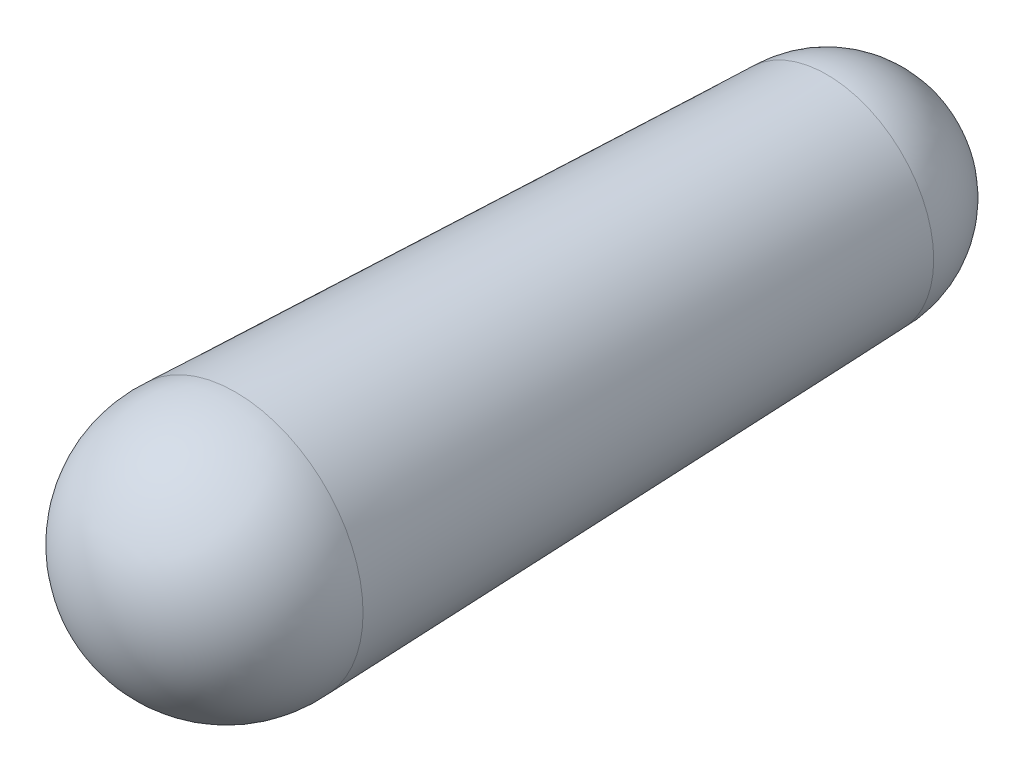
ISO-10303-21;
HEADER;
FILE_DESCRIPTION(('STEP AP214'),'2;1');
FILE_NAME('part.step','',(''),(''),'','','');
FILE_SCHEMA(('AUTOMOTIVE_DESIGN { 1 0 10303 214 1 1 1 1 }'));
ENDSEC;
DATA;
#1=APPLICATION_CONTEXT('core data for automotive mechanical design processes');
#2=APPLICATION_PROTOCOL_DEFINITION('international standard','automotive_design',2000,#1);
#3=PRODUCT_CONTEXT('',#1,'mechanical');
#4=PRODUCT('Part','Part','',(#3));
#5=PRODUCT_RELATED_PRODUCT_CATEGORY('part','',(#4));
#6=PRODUCT_DEFINITION_FORMATION('','',#4);
#7=PRODUCT_DEFINITION_CONTEXT('part definition',#1,'design');
#8=PRODUCT_DEFINITION('design','',#6,#7);
#9=PRODUCT_DEFINITION_SHAPE('','',#8);
#10=(LENGTH_UNIT() NAMED_UNIT(*) SI_UNIT(.MILLI.,.METRE.));
#11=(NAMED_UNIT(*) PLANE_ANGLE_UNIT() SI_UNIT($,.RADIAN.));
#12=(NAMED_UNIT(*) SI_UNIT($,.STERADIAN.) SOLID_ANGLE_UNIT());
#13=UNCERTAINTY_MEASURE_WITH_UNIT(LENGTH_MEASURE(1.E-05),#10,'distance_accuracy_value','');
#14=(GEOMETRIC_REPRESENTATION_CONTEXT(3) GLOBAL_UNCERTAINTY_ASSIGNED_CONTEXT((#13)) GLOBAL_UNIT_ASSIGNED_CONTEXT((#10,
#11,#12)) REPRESENTATION_CONTEXT('',''));
#15=CARTESIAN_POINT('',(0.,0.,0.));
#16=DIRECTION('',(0.,0.,1.));
#17=DIRECTION('',(1.,0.,0.));
#18=AXIS2_PLACEMENT_3D('',#15,#16,#17);
#19=CARTESIAN_POINT('',(0.,0.,0.));
#20=DIRECTION('',(0.,1.,0.));
#21=DIRECTION('',(1.,0.,0.));
#22=AXIS2_PLACEMENT_3D('',#19,#20,#21);
#23=SPHERICAL_SURFACE('',#22,2.13);
#24=CARTESIAN_POINT('',(0.,0.,0.));
#25=DIRECTION('',(0.,0.,-1.));
#26=DIRECTION('',(-1.,0.,0.));
#27=AXIS2_PLACEMENT_3D('',#24,#25,#26);
#28=SPHERICAL_SURFACE('',#27,2.13);
#29=CARTESIAN_POINT('',(0.,0.,-0.148581289076952));
#30=DIRECTION('',(0.,0.,-1.));
#31=DIRECTION('',(-1.,0.,0.));
#32=AXIS2_PLACEMENT_3D('',#29,#30,#31);
#33=CIRCLE('',#32,2.12481142705336);
#34=CARTESIAN_POINT('',(-2.12481142705336,0.,-0.148581289076952));
#35=VERTEX_POINT('',#34);
#36=EDGE_CURVE('E10',#35,#35,#33,.F.);
#37=ORIENTED_EDGE('',*,*,#36,.T.);
#38=EDGE_LOOP('',(#37));
#39=FACE_BOUND('',#38,.T.);
#40=ADVANCED_FACE('F35',(#39),#28,.T.);
#41=CARTESIAN_POINT('',(0.,0.,0.));
#42=DIRECTION('',(0.,0.,1.));
#43=DIRECTION('',(1.,0.,0.));
#44=AXIS2_PLACEMENT_3D('',#41,#42,#43);
#45=CONICAL_SURFACE('',#44,2.13,0.0349065850398866);
#46=CARTESIAN_POINT('',(0.,0.,-10.));
#47=DIRECTION('',(0.,0.,1.));
#48=DIRECTION('',(1.,0.,0.));
#49=AXIS2_PLACEMENT_3D('',#46,#47,#48);
#50=CIRCLE('',#49,1.78079230508252);
#51=CARTESIAN_POINT('',(1.78079230508252,0.,-10.));
#52=VERTEX_POINT('',#51);
#53=EDGE_CURVE('E41',#52,#52,#50,.T.);
#54=ORIENTED_EDGE('',*,*,#53,.T.);
#55=EDGE_LOOP('',(#54));
#56=FACE_BOUND('',#55,.T.);
#57=ORIENTED_EDGE('',*,*,#36,.F.);
#58=EDGE_LOOP('',(#57));
#59=FACE_BOUND('',#58,.T.);
#60=ADVANCED_FACE('F47',(#56,#59),#45,.T.);
#61=CARTESIAN_POINT('',(0.,0.,-10.));
#62=DIRECTION('',(0.,1.,0.));
#63=DIRECTION('',(1.,0.,0.));
#64=AXIS2_PLACEMENT_3D('',#61,#62,#63);
#65=SPHERICAL_SURFACE('',#64,1.78079230508252);
#66=CARTESIAN_POINT('',(0.,0.,-10.));
#67=DIRECTION('',(0.,0.,1.));
#68=DIRECTION('',(1.,0.,0.));
#69=AXIS2_PLACEMENT_3D('',#66,#67,#68);
#70=SPHERICAL_SURFACE('',#69,1.78079230508252);
#71=ORIENTED_EDGE('',*,*,#53,.F.);
#72=EDGE_LOOP('',(#71));
#73=FACE_BOUND('',#72,.T.);
#74=ADVANCED_FACE('F50',(#73),#70,.T.);
#75=CLOSED_SHELL('',(#40,#60,#74));
#76=MANIFOLD_SOLID_BREP('B2',#75);
#77=ADVANCED_BREP_SHAPE_REPRESENTATION('',(#18,#76),#14);
#78=SHAPE_DEFINITION_REPRESENTATION(#9,#77);
ENDSEC;
END-ISO-10303-21;
